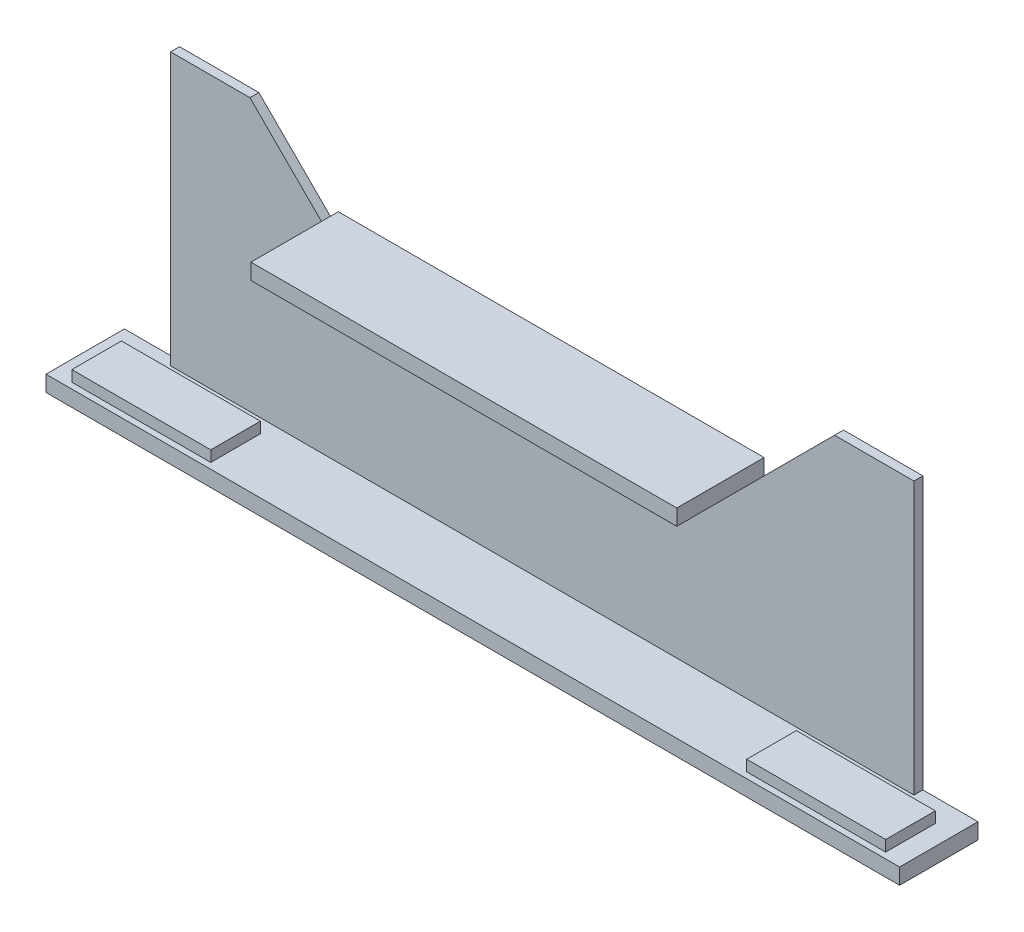
ISO-10303-21;
HEADER;
FILE_DESCRIPTION(('STEP AP214'),'2;1');
FILE_NAME('part.step','',(''),(''),'','','');
FILE_SCHEMA(('AUTOMOTIVE_DESIGN { 1 0 10303 214 1 1 1 1 }'));
ENDSEC;
DATA;
#1=APPLICATION_CONTEXT('core data for automotive mechanical design processes');
#2=APPLICATION_PROTOCOL_DEFINITION('international standard','automotive_design',2000,#1);
#3=PRODUCT_CONTEXT('',#1,'mechanical');
#4=PRODUCT('Part','Part','',(#3));
#5=PRODUCT_RELATED_PRODUCT_CATEGORY('part','',(#4));
#6=PRODUCT_DEFINITION_FORMATION('','',#4);
#7=PRODUCT_DEFINITION_CONTEXT('part definition',#1,'design');
#8=PRODUCT_DEFINITION('design','',#6,#7);
#9=PRODUCT_DEFINITION_SHAPE('','',#8);
#10=(LENGTH_UNIT() NAMED_UNIT(*) SI_UNIT(.MILLI.,.METRE.));
#11=(NAMED_UNIT(*) PLANE_ANGLE_UNIT() SI_UNIT($,.RADIAN.));
#12=(NAMED_UNIT(*) SI_UNIT($,.STERADIAN.) SOLID_ANGLE_UNIT());
#13=UNCERTAINTY_MEASURE_WITH_UNIT(LENGTH_MEASURE(1.E-05),#10,'distance_accuracy_value','');
#14=(GEOMETRIC_REPRESENTATION_CONTEXT(3) GLOBAL_UNCERTAINTY_ASSIGNED_CONTEXT((#13)) GLOBAL_UNIT_ASSIGNED_CONTEXT((#10,
#11,#12)) REPRESENTATION_CONTEXT('',''));
#15=CARTESIAN_POINT('',(0.,0.,0.));
#16=DIRECTION('',(0.,0.,1.));
#17=DIRECTION('',(1.,0.,0.));
#18=AXIS2_PLACEMENT_3D('',#15,#16,#17);
#19=CARTESIAN_POINT('',(0.,15.9999999999956,9.));
#20=DIRECTION('',(0.,0.,-1.));
#21=DIRECTION('',(-1.,0.,0.));
#22=AXIS2_PLACEMENT_3D('',#19,#20,#21);
#23=PLANE('',#22);
#24=DIRECTION('',(1.,0.,0.));
#25=VECTOR('',#24,1.);
#26=CARTESIAN_POINT('',(215.5,210.,9.));
#27=LINE('',#26,#25);
#28=CARTESIAN_POINT('',(215.5,210.,9.));
#29=VERTEX_POINT('',#28);
#30=CARTESIAN_POINT('',(644.50000000001,210.,9.));
#31=VERTEX_POINT('',#30);
#32=EDGE_CURVE('E217',#29,#31,#27,.T.);
#33=ORIENTED_EDGE('',*,*,#32,.F.);
#34=DIRECTION('',(-0.707106781186546,0.707106781186549,0.));
#35=VECTOR('',#34,1.);
#36=CARTESIAN_POINT('',(135.5,290.,9.));
#37=LINE('',#36,#35);
#38=CARTESIAN_POINT('',(135.5,290.,9.));
#39=VERTEX_POINT('',#38);
#40=EDGE_CURVE('E299',#29,#39,#37,.T.);
#41=ORIENTED_EDGE('',*,*,#40,.T.);
#42=DIRECTION('',(-1.,0.,0.));
#43=VECTOR('',#42,1.);
#44=CARTESIAN_POINT('',(55.4999999999975,289.999999999996,9.));
#45=LINE('',#44,#43);
#46=CARTESIAN_POINT('',(55.4999999999975,289.999999999996,9.));
#47=VERTEX_POINT('',#46);
#48=EDGE_CURVE('E301',#39,#47,#45,.T.);
#49=ORIENTED_EDGE('',*,*,#48,.T.);
#50=DIRECTION('',(0.,-1.,0.));
#51=VECTOR('',#50,1.);
#52=CARTESIAN_POINT('',(55.4999999999975,15.9999999999956,9.));
#53=LINE('',#52,#51);
#54=CARTESIAN_POINT('',(55.4999999999975,15.9999999999956,9.));
#55=VERTEX_POINT('',#54);
#56=EDGE_CURVE('E303',#47,#55,#53,.T.);
#57=ORIENTED_EDGE('',*,*,#56,.T.);
#58=DIRECTION('',(-1.,0.,0.));
#59=VECTOR('',#58,1.);
#60=CARTESIAN_POINT('',(0.,15.9999999999956,9.));
#61=LINE('',#60,#59);
#62=CARTESIAN_POINT('',(804.499999999995,15.9999999999956,9.));
#63=VERTEX_POINT('',#62);
#64=EDGE_CURVE('E11',#63,#55,#61,.T.);
#65=ORIENTED_EDGE('',*,*,#64,.F.);
#66=DIRECTION('',(0.,1.,0.));
#67=VECTOR('',#66,1.);
#68=CARTESIAN_POINT('',(804.499999999995,15.9999999999956,9.));
#69=LINE('',#68,#67);
#70=CARTESIAN_POINT('',(804.499999999995,289.999999999996,9.));
#71=VERTEX_POINT('',#70);
#72=EDGE_CURVE('E297',#63,#71,#69,.T.);
#73=ORIENTED_EDGE('',*,*,#72,.T.);
#74=DIRECTION('',(-1.,0.,0.));
#75=VECTOR('',#74,1.);
#76=CARTESIAN_POINT('',(804.499999999995,289.999999999996,9.));
#77=LINE('',#76,#75);
#78=CARTESIAN_POINT('',(724.5,290.,9.));
#79=VERTEX_POINT('',#78);
#80=EDGE_CURVE('E294',#71,#79,#77,.T.);
#81=ORIENTED_EDGE('',*,*,#80,.T.);
#82=DIRECTION('',(-0.707106781186501,-0.707106781186594,0.));
#83=VECTOR('',#82,1.);
#84=CARTESIAN_POINT('',(724.5,290.,9.));
#85=LINE('',#84,#83);
#86=EDGE_CURVE('E296',#79,#31,#85,.T.);
#87=ORIENTED_EDGE('',*,*,#86,.T.);
#88=EDGE_LOOP('',(#33,#41,#49,#57,#65,#73,#81,#87));
#89=FACE_BOUND('',#88,.T.);
#90=ADVANCED_FACE('F34',(#89),#23,.F.);
#91=CARTESIAN_POINT('',(0.,15.9999999999956,9.));
#92=DIRECTION('',(0.,-1.,0.));
#93=DIRECTION('',(0.,0.,-1.));
#94=AXIS2_PLACEMENT_3D('',#91,#92,#93);
#95=PLANE('',#94);
#96=DIRECTION('',(-1.02487462960706E-13,0.,1.));
#97=VECTOR('',#96,1.);
#98=CARTESIAN_POINT('',(20.0000000000051,15.9999999999956,22.9999999999981));
#99=LINE('',#98,#97);
#100=CARTESIAN_POINT('',(20.0000000000051,15.9999999999956,22.9999999999981));
#101=VERTEX_POINT('',#100);
#102=CARTESIAN_POINT('',(20.,15.9999999999956,73.));
#103=VERTEX_POINT('',#102);
#104=EDGE_CURVE('E248',#101,#103,#99,.T.);
#105=ORIENTED_EDGE('',*,*,#104,.F.);
#106=DIRECTION('',(-1.,0.,0.));
#107=VECTOR('',#106,1.);
#108=CARTESIAN_POINT('',(20.0000000000051,15.9999999999956,22.9999999999981));
#109=LINE('',#108,#107);
#110=CARTESIAN_POINT('',(160.,15.9999999999956,23.));
#111=VERTEX_POINT('',#110);
#112=EDGE_CURVE('E253',#111,#101,#109,.T.);
#113=ORIENTED_EDGE('',*,*,#112,.F.);
#114=DIRECTION('',(0.,0.,-1.));
#115=VECTOR('',#114,1.);
#116=CARTESIAN_POINT('',(160.,15.9999999999956,23.));
#117=LINE('',#116,#115);
#118=CARTESIAN_POINT('',(160.,15.9999999999956,73.));
#119=VERTEX_POINT('',#118);
#120=EDGE_CURVE('E265',#119,#111,#117,.T.);
#121=ORIENTED_EDGE('',*,*,#120,.F.);
#122=DIRECTION('',(1.,0.,0.));
#123=VECTOR('',#122,1.);
#124=CARTESIAN_POINT('',(20.,15.9999999999956,73.));
#125=LINE('',#124,#123);
#126=EDGE_CURVE('E262',#103,#119,#125,.T.);
#127=ORIENTED_EDGE('',*,*,#126,.F.);
#128=EDGE_LOOP('',(#105,#113,#121,#127));
#129=FACE_BOUND('',#128,.T.);
#130=DIRECTION('',(-1.,0.,0.));
#131=VECTOR('',#130,1.);
#132=CARTESIAN_POINT('',(0.,15.9999999999956,0.));
#133=LINE('',#132,#131);
#134=CARTESIAN_POINT('',(55.4999999999975,15.9999999999956,0.));
#135=VERTEX_POINT('',#134);
#136=CARTESIAN_POINT('',(0.,15.9999999999956,0.));
#137=VERTEX_POINT('',#136);
#138=EDGE_CURVE('E330',#135,#137,#133,.T.);
#139=ORIENTED_EDGE('',*,*,#138,.T.);
#140=DIRECTION('',(0.,0.,-1.));
#141=VECTOR('',#140,1.);
#142=CARTESIAN_POINT('',(0.,15.9999999999956,9.));
#143=LINE('',#142,#141);
#144=CARTESIAN_POINT('',(0.,15.9999999999956,79.));
#145=VERTEX_POINT('',#144);
#146=EDGE_CURVE('E332',#145,#137,#143,.T.);
#147=ORIENTED_EDGE('',*,*,#146,.F.);
#148=DIRECTION('',(-1.,0.,0.));
#149=VECTOR('',#148,1.);
#150=CARTESIAN_POINT('',(0.,15.9999999999956,79.));
#151=LINE('',#150,#149);
#152=CARTESIAN_POINT('',(859.999999999992,15.9999999999956,79.));
#153=VERTEX_POINT('',#152);
#154=EDGE_CURVE('E290',#153,#145,#151,.T.);
#155=ORIENTED_EDGE('',*,*,#154,.F.);
#156=DIRECTION('',(0.,0.,-1.));
#157=VECTOR('',#156,1.);
#158=CARTESIAN_POINT('',(859.999999999992,15.9999999999956,9.));
#159=LINE('',#158,#157);
#160=CARTESIAN_POINT('',(859.999999999992,15.9999999999956,0.));
#161=VERTEX_POINT('',#160);
#162=EDGE_CURVE('E361',#153,#161,#159,.T.);
#163=ORIENTED_EDGE('',*,*,#162,.T.);
#164=DIRECTION('',(-1.,0.,0.));
#165=VECTOR('',#164,1.);
#166=CARTESIAN_POINT('',(859.999999999992,15.9999999999956,0.));
#167=LINE('',#166,#165);
#168=CARTESIAN_POINT('',(804.499999999995,15.9999999999956,0.));
#169=VERTEX_POINT('',#168);
#170=EDGE_CURVE('E310',#161,#169,#167,.T.);
#171=ORIENTED_EDGE('',*,*,#170,.T.);
#172=DIRECTION('',(0.,0.,-1.));
#173=VECTOR('',#172,1.);
#174=CARTESIAN_POINT('',(804.499999999995,15.9999999999956,9.));
#175=LINE('',#174,#173);
#176=EDGE_CURVE('E360',#63,#169,#175,.T.);
#177=ORIENTED_EDGE('',*,*,#176,.F.);
#178=ORIENTED_EDGE('',*,*,#64,.T.);
#179=DIRECTION('',(0.,0.,-1.));
#180=VECTOR('',#179,1.);
#181=CARTESIAN_POINT('',(55.4999999999975,15.9999999999956,9.));
#182=LINE('',#181,#180);
#183=EDGE_CURVE('E335',#55,#135,#182,.T.);
#184=ORIENTED_EDGE('',*,*,#183,.T.);
#185=EDGE_LOOP('',(#139,#147,#155,#163,#171,#177,#178,#184));
#186=FACE_BOUND('',#185,.T.);
#187=DIRECTION('',(1.06581410364011E-13,0.,-1.));
#188=VECTOR('',#187,1.);
#189=CARTESIAN_POINT('',(839.999999999998,15.9999999999956,22.9999999999981));
#190=LINE('',#189,#188);
#191=CARTESIAN_POINT('',(839.999999999993,15.9999999999956,73.));
#192=VERTEX_POINT('',#191);
#193=CARTESIAN_POINT('',(839.999999999998,15.9999999999956,22.9999999999981));
#194=VERTEX_POINT('',#193);
#195=EDGE_CURVE('E237',#192,#194,#190,.T.);
#196=ORIENTED_EDGE('',*,*,#195,.F.);
#197=DIRECTION('',(1.,0.,0.));
#198=VECTOR('',#197,1.);
#199=CARTESIAN_POINT('',(839.999999999993,15.9999999999956,73.));
#200=LINE('',#199,#198);
#201=CARTESIAN_POINT('',(699.999999999993,15.9999999999956,73.));
#202=VERTEX_POINT('',#201);
#203=EDGE_CURVE('E242',#202,#192,#200,.T.);
#204=ORIENTED_EDGE('',*,*,#203,.F.);
#205=DIRECTION('',(0.,0.,1.));
#206=VECTOR('',#205,1.);
#207=CARTESIAN_POINT('',(699.999999999992,15.9999999999956,23.));
#208=LINE('',#207,#206);
#209=CARTESIAN_POINT('',(699.999999999992,15.9999999999956,23.));
#210=VERTEX_POINT('',#209);
#211=EDGE_CURVE('E56',#210,#202,#208,.T.);
#212=ORIENTED_EDGE('',*,*,#211,.F.);
#213=DIRECTION('',(-1.,0.,0.));
#214=VECTOR('',#213,1.);
#215=CARTESIAN_POINT('',(839.999999999998,15.9999999999956,22.9999999999981));
#216=LINE('',#215,#214);
#217=EDGE_CURVE('E51',#194,#210,#216,.T.);
#218=ORIENTED_EDGE('',*,*,#217,.F.);
#219=EDGE_LOOP('',(#196,#204,#212,#218));
#220=FACE_BOUND('',#219,.T.);
#221=ADVANCED_FACE('F427',(#129,#186,#220),#95,.F.);
#222=CARTESIAN_POINT('',(0.,15.9999999999956,0.));
#223=DIRECTION('',(0.,0.,-1.));
#224=DIRECTION('',(-1.,0.,0.));
#225=AXIS2_PLACEMENT_3D('',#222,#223,#224);
#226=PLANE('',#225);
#227=ORIENTED_EDGE('',*,*,#138,.F.);
#228=DIRECTION('',(0.,-1.,0.));
#229=VECTOR('',#228,1.);
#230=CARTESIAN_POINT('',(55.4999999999975,15.9999999999956,0.));
#231=LINE('',#230,#229);
#232=CARTESIAN_POINT('',(55.4999999999975,289.999999999996,0.));
#233=VERTEX_POINT('',#232);
#234=EDGE_CURVE('E328',#233,#135,#231,.T.);
#235=ORIENTED_EDGE('',*,*,#234,.F.);
#236=DIRECTION('',(-1.,0.,0.));
#237=VECTOR('',#236,1.);
#238=CARTESIAN_POINT('',(55.4999999999975,289.999999999996,0.));
#239=LINE('',#238,#237);
#240=CARTESIAN_POINT('',(135.5,290.,0.));
#241=VERTEX_POINT('',#240);
#242=EDGE_CURVE('E326',#241,#233,#239,.T.);
#243=ORIENTED_EDGE('',*,*,#242,.F.);
#244=DIRECTION('',(-0.707106781186546,0.707106781186549,0.));
#245=VECTOR('',#244,1.);
#246=CARTESIAN_POINT('',(135.5,290.,0.));
#247=LINE('',#246,#245);
#248=CARTESIAN_POINT('',(215.5,210.,0.));
#249=VERTEX_POINT('',#248);
#250=EDGE_CURVE('E324',#249,#241,#247,.T.);
#251=ORIENTED_EDGE('',*,*,#250,.F.);
#252=DIRECTION('',(0.,-1.,0.));
#253=VECTOR('',#252,1.);
#254=CARTESIAN_POINT('',(215.5,210.,0.));
#255=LINE('',#254,#253);
#256=CARTESIAN_POINT('',(215.5,226.,0.));
#257=VERTEX_POINT('',#256);
#258=EDGE_CURVE('E322',#257,#249,#255,.T.);
#259=ORIENTED_EDGE('',*,*,#258,.F.);
#260=DIRECTION('',(-1.,0.,0.));
#261=VECTOR('',#260,1.);
#262=CARTESIAN_POINT('',(215.5,226.,0.));
#263=LINE('',#262,#261);
#264=CARTESIAN_POINT('',(644.50000000001,226.,0.));
#265=VERTEX_POINT('',#264);
#266=EDGE_CURVE('E320',#265,#257,#263,.T.);
#267=ORIENTED_EDGE('',*,*,#266,.F.);
#268=DIRECTION('',(0.,1.,0.));
#269=VECTOR('',#268,1.);
#270=CARTESIAN_POINT('',(644.50000000001,210.,0.));
#271=LINE('',#270,#269);
#272=CARTESIAN_POINT('',(644.50000000001,210.,0.));
#273=VERTEX_POINT('',#272);
#274=EDGE_CURVE('E318',#273,#265,#271,.T.);
#275=ORIENTED_EDGE('',*,*,#274,.F.);
#276=DIRECTION('',(-0.707106781186501,-0.707106781186594,0.));
#277=VECTOR('',#276,1.);
#278=CARTESIAN_POINT('',(724.5,290.,0.));
#279=LINE('',#278,#277);
#280=CARTESIAN_POINT('',(724.5,290.,0.));
#281=VERTEX_POINT('',#280);
#282=EDGE_CURVE('E316',#281,#273,#279,.T.);
#283=ORIENTED_EDGE('',*,*,#282,.F.);
#284=DIRECTION('',(-1.,0.,0.));
#285=VECTOR('',#284,1.);
#286=CARTESIAN_POINT('',(804.499999999995,289.999999999996,0.));
#287=LINE('',#286,#285);
#288=CARTESIAN_POINT('',(804.499999999995,289.999999999996,0.));
#289=VERTEX_POINT('',#288);
#290=EDGE_CURVE('E314',#289,#281,#287,.T.);
#291=ORIENTED_EDGE('',*,*,#290,.F.);
#292=DIRECTION('',(0.,1.,0.));
#293=VECTOR('',#292,1.);
#294=CARTESIAN_POINT('',(804.499999999995,15.9999999999956,0.));
#295=LINE('',#294,#293);
#296=EDGE_CURVE('E312',#169,#289,#295,.T.);
#297=ORIENTED_EDGE('',*,*,#296,.F.);
#298=ORIENTED_EDGE('',*,*,#170,.F.);
#299=DIRECTION('',(-4.64905891561913E-13,1.,0.));
#300=VECTOR('',#299,1.);
#301=CARTESIAN_POINT('',(860.,0.,0.));
#302=LINE('',#301,#300);
#303=CARTESIAN_POINT('',(860.,0.,0.));
#304=VERTEX_POINT('',#303);
#305=EDGE_CURVE('E308',#304,#161,#302,.T.);
#306=ORIENTED_EDGE('',*,*,#305,.F.);
#307=DIRECTION('',(1.,0.,0.));
#308=VECTOR('',#307,1.);
#309=CARTESIAN_POINT('',(0.,0.,0.));
#310=LINE('',#309,#308);
#311=CARTESIAN_POINT('',(0.,0.,0.));
#312=VERTEX_POINT('',#311);
#313=EDGE_CURVE('E306',#312,#304,#310,.T.);
#314=ORIENTED_EDGE('',*,*,#313,.F.);
#315=DIRECTION('',(0.,-1.,0.));
#316=VECTOR('',#315,1.);
#317=CARTESIAN_POINT('',(0.,0.,0.));
#318=LINE('',#317,#316);
#319=EDGE_CURVE('E293',#137,#312,#318,.T.);
#320=ORIENTED_EDGE('',*,*,#319,.F.);
#321=EDGE_LOOP('',(#227,#235,#243,#251,#259,#267,#275,#283,#291,#297,#298,#306,#314,#320));
#322=FACE_BOUND('',#321,.T.);
#323=ADVANCED_FACE('F415',(#322),#226,.T.);
#324=CARTESIAN_POINT('',(0.,0.,9.));
#325=DIRECTION('',(1.,0.,0.));
#326=DIRECTION('',(0.,1.,0.));
#327=AXIS2_PLACEMENT_3D('',#324,#325,#326);
#328=PLANE('',#327);
#329=ORIENTED_EDGE('',*,*,#319,.T.);
#330=DIRECTION('',(0.,0.,-1.));
#331=VECTOR('',#330,1.);
#332=CARTESIAN_POINT('',(0.,0.,9.));
#333=LINE('',#332,#331);
#334=CARTESIAN_POINT('',(0.,0.,79.));
#335=VERTEX_POINT('',#334);
#336=EDGE_CURVE('E43',#335,#312,#333,.T.);
#337=ORIENTED_EDGE('',*,*,#336,.F.);
#338=DIRECTION('',(0.,-1.,0.));
#339=VECTOR('',#338,1.);
#340=CARTESIAN_POINT('',(0.,0.,79.));
#341=LINE('',#340,#339);
#342=EDGE_CURVE('E281',#145,#335,#341,.T.);
#343=ORIENTED_EDGE('',*,*,#342,.F.);
#344=ORIENTED_EDGE('',*,*,#146,.T.);
#345=EDGE_LOOP('',(#329,#337,#343,#344));
#346=FACE_BOUND('',#345,.T.);
#347=ADVANCED_FACE('F36',(#346),#328,.F.);
#348=CARTESIAN_POINT('',(0.,0.,9.));
#349=DIRECTION('',(0.,1.,0.));
#350=DIRECTION('',(0.,0.,1.));
#351=AXIS2_PLACEMENT_3D('',#348,#349,#350);
#352=PLANE('',#351);
#353=ORIENTED_EDGE('',*,*,#313,.T.);
#354=DIRECTION('',(0.,0.,-1.));
#355=VECTOR('',#354,1.);
#356=CARTESIAN_POINT('',(860.,0.,9.));
#357=LINE('',#356,#355);
#358=CARTESIAN_POINT('',(860.,0.,79.));
#359=VERTEX_POINT('',#358);
#360=EDGE_CURVE('E364',#359,#304,#357,.T.);
#361=ORIENTED_EDGE('',*,*,#360,.F.);
#362=DIRECTION('',(1.,0.,0.));
#363=VECTOR('',#362,1.);
#364=CARTESIAN_POINT('',(0.,0.,79.));
#365=LINE('',#364,#363);
#366=EDGE_CURVE('E284',#335,#359,#365,.T.);
#367=ORIENTED_EDGE('',*,*,#366,.F.);
#368=ORIENTED_EDGE('',*,*,#336,.T.);
#369=EDGE_LOOP('',(#353,#361,#367,#368));
#370=FACE_BOUND('',#369,.T.);
#371=ADVANCED_FACE('F606',(#370),#352,.F.);
#372=CARTESIAN_POINT('',(860.,0.,9.));
#373=DIRECTION('',(-1.,-4.64905891561913E-13,0.));
#374=DIRECTION('',(4.64905891561913E-13,-1.,0.));
#375=AXIS2_PLACEMENT_3D('',#372,#373,#374);
#376=PLANE('',#375);
#377=ORIENTED_EDGE('',*,*,#305,.T.);
#378=ORIENTED_EDGE('',*,*,#162,.F.);
#379=DIRECTION('',(-4.64905891561913E-13,1.,0.));
#380=VECTOR('',#379,1.);
#381=CARTESIAN_POINT('',(859.999999999992,15.9999999999956,79.));
#382=LINE('',#381,#380);
#383=EDGE_CURVE('E287',#359,#153,#382,.T.);
#384=ORIENTED_EDGE('',*,*,#383,.F.);
#385=ORIENTED_EDGE('',*,*,#360,.T.);
#386=EDGE_LOOP('',(#377,#378,#384,#385));
#387=FACE_BOUND('',#386,.T.);
#388=ADVANCED_FACE('F611',(#387),#376,.F.);
#389=CARTESIAN_POINT('',(804.499999999995,15.9999999999956,9.));
#390=DIRECTION('',(-1.,0.,0.));
#391=DIRECTION('',(0.,0.,1.));
#392=AXIS2_PLACEMENT_3D('',#389,#390,#391);
#393=PLANE('',#392);
#394=ORIENTED_EDGE('',*,*,#296,.T.);
#395=DIRECTION('',(0.,0.,-1.));
#396=VECTOR('',#395,1.);
#397=CARTESIAN_POINT('',(804.499999999995,289.999999999996,9.));
#398=LINE('',#397,#396);
#399=EDGE_CURVE('E357',#71,#289,#398,.T.);
#400=ORIENTED_EDGE('',*,*,#399,.F.);
#401=ORIENTED_EDGE('',*,*,#72,.F.);
#402=ORIENTED_EDGE('',*,*,#176,.T.);
#403=EDGE_LOOP('',(#394,#400,#401,#402));
#404=FACE_BOUND('',#403,.T.);
#405=ADVANCED_FACE('F389',(#404),#393,.F.);
#406=CARTESIAN_POINT('',(804.499999999995,289.999999999996,9.));
#407=DIRECTION('',(0.,-1.,0.));
#408=DIRECTION('',(1.,0.,0.));
#409=AXIS2_PLACEMENT_3D('',#406,#407,#408);
#410=PLANE('',#409);
#411=ORIENTED_EDGE('',*,*,#290,.T.);
#412=DIRECTION('',(0.,0.,-1.));
#413=VECTOR('',#412,1.);
#414=CARTESIAN_POINT('',(724.5,290.,9.));
#415=LINE('',#414,#413);
#416=EDGE_CURVE('E354',#79,#281,#415,.T.);
#417=ORIENTED_EDGE('',*,*,#416,.F.);
#418=ORIENTED_EDGE('',*,*,#80,.F.);
#419=ORIENTED_EDGE('',*,*,#399,.T.);
#420=EDGE_LOOP('',(#411,#417,#418,#419));
#421=FACE_BOUND('',#420,.T.);
#422=ADVANCED_FACE('F393',(#421),#410,.F.);
#423=CARTESIAN_POINT('',(724.5,290.,9.));
#424=DIRECTION('',(0.707106781186594,-0.707106781186501,0.));
#425=DIRECTION('',(0.707106781186501,0.707106781186594,0.));
#426=AXIS2_PLACEMENT_3D('',#423,#424,#425);
#427=PLANE('',#426);
#428=ORIENTED_EDGE('',*,*,#282,.T.);
#429=DIRECTION('',(0.,0.,-1.));
#430=VECTOR('',#429,1.);
#431=CARTESIAN_POINT('',(644.50000000001,210.,9.));
#432=LINE('',#431,#430);
#433=EDGE_CURVE('E351',#31,#273,#432,.T.);
#434=ORIENTED_EDGE('',*,*,#433,.F.);
#435=ORIENTED_EDGE('',*,*,#86,.F.);
#436=ORIENTED_EDGE('',*,*,#416,.T.);
#437=EDGE_LOOP('',(#428,#434,#435,#436));
#438=FACE_BOUND('',#437,.T.);
#439=ADVANCED_FACE('F398',(#438),#427,.F.);
#440=CARTESIAN_POINT('',(644.50000000001,210.,9.));
#441=DIRECTION('',(-1.,0.,0.));
#442=DIRECTION('',(0.,0.,1.));
#443=AXIS2_PLACEMENT_3D('',#440,#441,#442);
#444=PLANE('',#443);
#445=ORIENTED_EDGE('',*,*,#274,.T.);
#446=DIRECTION('',(0.,0.,-1.));
#447=VECTOR('',#446,1.);
#448=CARTESIAN_POINT('',(644.50000000001,226.,9.));
#449=LINE('',#448,#447);
#450=CARTESIAN_POINT('',(644.5,226.,88.));
#451=VERTEX_POINT('',#450);
#452=EDGE_CURVE('E348',#451,#265,#449,.T.);
#453=ORIENTED_EDGE('',*,*,#452,.F.);
#454=DIRECTION('',(0.,1.,0.));
#455=VECTOR('',#454,1.);
#456=CARTESIAN_POINT('',(644.5,226.,88.));
#457=LINE('',#456,#455);
#458=CARTESIAN_POINT('',(644.5,210.,88.));
#459=VERTEX_POINT('',#458);
#460=EDGE_CURVE('E223',#459,#451,#457,.T.);
#461=ORIENTED_EDGE('',*,*,#460,.F.);
#462=DIRECTION('',(0.,0.,-1.));
#463=VECTOR('',#462,1.);
#464=CARTESIAN_POINT('',(644.5,210.,88.));
#465=LINE('',#464,#463);
#466=EDGE_CURVE('E229',#459,#31,#465,.T.);
#467=ORIENTED_EDGE('',*,*,#466,.T.);
#468=ORIENTED_EDGE('',*,*,#433,.T.);
#469=EDGE_LOOP('',(#445,#453,#461,#467,#468));
#470=FACE_BOUND('',#469,.T.);
#471=ADVANCED_FACE('F432',(#470),#444,.F.);
#472=CARTESIAN_POINT('',(215.5,226.,9.));
#473=DIRECTION('',(0.,-1.,0.));
#474=DIRECTION('',(0.,0.,-1.));
#475=AXIS2_PLACEMENT_3D('',#472,#473,#474);
#476=PLANE('',#475);
#477=ORIENTED_EDGE('',*,*,#266,.T.);
#478=DIRECTION('',(0.,0.,-1.));
#479=VECTOR('',#478,1.);
#480=CARTESIAN_POINT('',(215.5,226.,9.));
#481=LINE('',#480,#479);
#482=CARTESIAN_POINT('',(215.5,226.,88.));
#483=VERTEX_POINT('',#482);
#484=EDGE_CURVE('E345',#483,#257,#481,.T.);
#485=ORIENTED_EDGE('',*,*,#484,.F.);
#486=DIRECTION('',(-1.,0.,0.));
#487=VECTOR('',#486,1.);
#488=CARTESIAN_POINT('',(215.5,226.,88.));
#489=LINE('',#488,#487);
#490=EDGE_CURVE('E226',#451,#483,#489,.T.);
#491=ORIENTED_EDGE('',*,*,#490,.F.);
#492=ORIENTED_EDGE('',*,*,#452,.T.);
#493=EDGE_LOOP('',(#477,#485,#491,#492));
#494=FACE_BOUND('',#493,.T.);
#495=ADVANCED_FACE('F438',(#494),#476,.F.);
#496=CARTESIAN_POINT('',(215.5,210.,9.));
#497=DIRECTION('',(1.,0.,0.));
#498=DIRECTION('',(0.,1.,0.));
#499=AXIS2_PLACEMENT_3D('',#496,#497,#498);
#500=PLANE('',#499);
#501=ORIENTED_EDGE('',*,*,#258,.T.);
#502=DIRECTION('',(0.,0.,-1.));
#503=VECTOR('',#502,1.);
#504=CARTESIAN_POINT('',(215.5,210.,9.));
#505=LINE('',#504,#503);
#506=EDGE_CURVE('E342',#29,#249,#505,.T.);
#507=ORIENTED_EDGE('',*,*,#506,.F.);
#508=DIRECTION('',(0.,0.,-1.));
#509=VECTOR('',#508,1.);
#510=CARTESIAN_POINT('',(215.5,210.,88.));
#511=LINE('',#510,#509);
#512=CARTESIAN_POINT('',(215.5,210.,88.));
#513=VERTEX_POINT('',#512);
#514=EDGE_CURVE('E234',#513,#29,#511,.T.);
#515=ORIENTED_EDGE('',*,*,#514,.F.);
#516=DIRECTION('',(0.,-1.,0.));
#517=VECTOR('',#516,1.);
#518=CARTESIAN_POINT('',(215.5,226.,88.));
#519=LINE('',#518,#517);
#520=EDGE_CURVE('E218',#483,#513,#519,.T.);
#521=ORIENTED_EDGE('',*,*,#520,.F.);
#522=ORIENTED_EDGE('',*,*,#484,.T.);
#523=EDGE_LOOP('',(#501,#507,#515,#521,#522));
#524=FACE_BOUND('',#523,.T.);
#525=ADVANCED_FACE('F407',(#524),#500,.F.);
#526=CARTESIAN_POINT('',(135.5,290.,9.));
#527=DIRECTION('',(-0.707106781186549,-0.707106781186546,0.));
#528=DIRECTION('',(0.707106781186546,-0.707106781186549,0.));
#529=AXIS2_PLACEMENT_3D('',#526,#527,#528);
#530=PLANE('',#529);
#531=ORIENTED_EDGE('',*,*,#250,.T.);
#532=DIRECTION('',(0.,0.,-1.));
#533=VECTOR('',#532,1.);
#534=CARTESIAN_POINT('',(135.5,290.,9.));
#535=LINE('',#534,#533);
#536=EDGE_CURVE('E339',#39,#241,#535,.T.);
#537=ORIENTED_EDGE('',*,*,#536,.F.);
#538=ORIENTED_EDGE('',*,*,#40,.F.);
#539=ORIENTED_EDGE('',*,*,#506,.T.);
#540=EDGE_LOOP('',(#531,#537,#538,#539));
#541=FACE_BOUND('',#540,.T.);
#542=ADVANCED_FACE('F411',(#541),#530,.F.);
#543=CARTESIAN_POINT('',(55.4999999999975,289.999999999996,9.));
#544=DIRECTION('',(0.,-1.,0.));
#545=DIRECTION('',(1.,0.,0.));
#546=AXIS2_PLACEMENT_3D('',#543,#544,#545);
#547=PLANE('',#546);
#548=ORIENTED_EDGE('',*,*,#242,.T.);
#549=DIRECTION('',(0.,0.,-1.));
#550=VECTOR('',#549,1.);
#551=CARTESIAN_POINT('',(55.4999999999975,289.999999999996,9.));
#552=LINE('',#551,#550);
#553=EDGE_CURVE('E336',#47,#233,#552,.T.);
#554=ORIENTED_EDGE('',*,*,#553,.F.);
#555=ORIENTED_EDGE('',*,*,#48,.F.);
#556=ORIENTED_EDGE('',*,*,#536,.T.);
#557=EDGE_LOOP('',(#548,#554,#555,#556));
#558=FACE_BOUND('',#557,.T.);
#559=ADVANCED_FACE('F420',(#558),#547,.F.);
#560=CARTESIAN_POINT('',(55.4999999999975,15.9999999999956,9.));
#561=DIRECTION('',(1.,0.,0.));
#562=DIRECTION('',(0.,0.,-1.));
#563=AXIS2_PLACEMENT_3D('',#560,#561,#562);
#564=PLANE('',#563);
#565=ORIENTED_EDGE('',*,*,#234,.T.);
#566=ORIENTED_EDGE('',*,*,#183,.F.);
#567=ORIENTED_EDGE('',*,*,#56,.F.);
#568=ORIENTED_EDGE('',*,*,#553,.T.);
#569=EDGE_LOOP('',(#565,#566,#567,#568));
#570=FACE_BOUND('',#569,.T.);
#571=ADVANCED_FACE('F424',(#570),#564,.F.);
#572=CARTESIAN_POINT('',(0.,15.9999999999956,79.));
#573=DIRECTION('',(0.,0.,-1.));
#574=DIRECTION('',(-1.,0.,0.));
#575=AXIS2_PLACEMENT_3D('',#572,#573,#574);
#576=PLANE('',#575);
#577=ORIENTED_EDGE('',*,*,#342,.T.);
#578=ORIENTED_EDGE('',*,*,#366,.T.);
#579=ORIENTED_EDGE('',*,*,#383,.T.);
#580=ORIENTED_EDGE('',*,*,#154,.T.);
#581=EDGE_LOOP('',(#577,#578,#579,#580));
#582=FACE_BOUND('',#581,.T.);
#583=ADVANCED_FACE('F456',(#582),#576,.F.);
#584=CARTESIAN_POINT('',(20.0000000000051,26.9999999999956,22.9999999999981));
#585=DIRECTION('',(1.,0.,1.02487462960706E-13));
#586=DIRECTION('',(1.02487462960706E-13,0.,-1.));
#587=AXIS2_PLACEMENT_3D('',#584,#585,#586);
#588=PLANE('',#587);
#589=ORIENTED_EDGE('',*,*,#104,.T.);
#590=DIRECTION('',(0.,-1.,0.));
#591=VECTOR('',#590,1.);
#592=CARTESIAN_POINT('',(20.,26.9999999999956,73.));
#593=LINE('',#592,#591);
#594=CARTESIAN_POINT('',(20.,26.9999999999956,73.));
#595=VERTEX_POINT('',#594);
#596=EDGE_CURVE('E278',#595,#103,#593,.T.);
#597=ORIENTED_EDGE('',*,*,#596,.F.);
#598=DIRECTION('',(-1.02487462960706E-13,0.,1.));
#599=VECTOR('',#598,1.);
#600=CARTESIAN_POINT('',(20.0000000000051,26.9999999999956,22.9999999999981));
#601=LINE('',#600,#599);
#602=CARTESIAN_POINT('',(20.0000000000051,26.9999999999956,22.9999999999981));
#603=VERTEX_POINT('',#602);
#604=EDGE_CURVE('E249',#603,#595,#601,.T.);
#605=ORIENTED_EDGE('',*,*,#604,.F.);
#606=DIRECTION('',(0.,-1.,0.));
#607=VECTOR('',#606,1.);
#608=CARTESIAN_POINT('',(20.0000000000051,26.9999999999956,22.9999999999981));
#609=LINE('',#608,#607);
#610=EDGE_CURVE('E259',#603,#101,#609,.T.);
#611=ORIENTED_EDGE('',*,*,#610,.T.);
#612=EDGE_LOOP('',(#589,#597,#605,#611));
#613=FACE_BOUND('',#612,.T.);
#614=ADVANCED_FACE('F486',(#613),#588,.F.);
#615=CARTESIAN_POINT('',(20.,26.9999999999956,73.));
#616=DIRECTION('',(0.,0.,-1.));
#617=DIRECTION('',(-1.,0.,0.));
#618=AXIS2_PLACEMENT_3D('',#615,#616,#617);
#619=PLANE('',#618);
#620=ORIENTED_EDGE('',*,*,#126,.T.);
#621=DIRECTION('',(0.,-1.,0.));
#622=VECTOR('',#621,1.);
#623=CARTESIAN_POINT('',(160.,26.9999999999956,73.));
#624=LINE('',#623,#622);
#625=CARTESIAN_POINT('',(160.,26.9999999999956,73.));
#626=VERTEX_POINT('',#625);
#627=EDGE_CURVE('E275',#626,#119,#624,.T.);
#628=ORIENTED_EDGE('',*,*,#627,.F.);
#629=DIRECTION('',(1.,0.,0.));
#630=VECTOR('',#629,1.);
#631=CARTESIAN_POINT('',(20.,26.9999999999956,73.));
#632=LINE('',#631,#630);
#633=EDGE_CURVE('E252',#595,#626,#632,.T.);
#634=ORIENTED_EDGE('',*,*,#633,.F.);
#635=ORIENTED_EDGE('',*,*,#596,.T.);
#636=EDGE_LOOP('',(#620,#628,#634,#635));
#637=FACE_BOUND('',#636,.T.);
#638=ADVANCED_FACE('F493',(#637),#619,.F.);
#639=CARTESIAN_POINT('',(160.,26.9999999999956,23.));
#640=DIRECTION('',(-1.,0.,0.));
#641=DIRECTION('',(0.,0.,1.));
#642=AXIS2_PLACEMENT_3D('',#639,#640,#641);
#643=PLANE('',#642);
#644=ORIENTED_EDGE('',*,*,#120,.T.);
#645=DIRECTION('',(0.,-1.,0.));
#646=VECTOR('',#645,1.);
#647=CARTESIAN_POINT('',(160.,26.9999999999956,23.));
#648=LINE('',#647,#646);
#649=CARTESIAN_POINT('',(160.,26.9999999999956,23.));
#650=VERTEX_POINT('',#649);
#651=EDGE_CURVE('E272',#650,#111,#648,.T.);
#652=ORIENTED_EDGE('',*,*,#651,.F.);
#653=DIRECTION('',(0.,0.,-1.));
#654=VECTOR('',#653,1.);
#655=CARTESIAN_POINT('',(160.,26.9999999999956,23.));
#656=LINE('',#655,#654);
#657=EDGE_CURVE('E255',#626,#650,#656,.T.);
#658=ORIENTED_EDGE('',*,*,#657,.F.);
#659=ORIENTED_EDGE('',*,*,#627,.T.);
#660=EDGE_LOOP('',(#644,#652,#658,#659));
#661=FACE_BOUND('',#660,.T.);
#662=ADVANCED_FACE('F500',(#661),#643,.F.);
#663=CARTESIAN_POINT('',(20.0000000000051,26.9999999999956,22.9999999999981));
#664=DIRECTION('',(0.,0.,1.));
#665=DIRECTION('',(1.,0.,0.));
#666=AXIS2_PLACEMENT_3D('',#663,#664,#665);
#667=PLANE('',#666);
#668=ORIENTED_EDGE('',*,*,#112,.T.);
#669=ORIENTED_EDGE('',*,*,#610,.F.);
#670=DIRECTION('',(-1.,0.,0.));
#671=VECTOR('',#670,1.);
#672=CARTESIAN_POINT('',(20.0000000000051,26.9999999999956,22.9999999999981));
#673=LINE('',#672,#671);
#674=EDGE_CURVE('E257',#650,#603,#673,.T.);
#675=ORIENTED_EDGE('',*,*,#674,.F.);
#676=ORIENTED_EDGE('',*,*,#651,.T.);
#677=EDGE_LOOP('',(#668,#669,#675,#676));
#678=FACE_BOUND('',#677,.T.);
#679=ADVANCED_FACE('F508',(#678),#667,.F.);
#680=CARTESIAN_POINT('',(20.,26.9999999999956,73.));
#681=DIRECTION('',(0.,1.,0.));
#682=DIRECTION('',(0.,0.,1.));
#683=AXIS2_PLACEMENT_3D('',#680,#681,#682);
#684=PLANE('',#683);
#685=ORIENTED_EDGE('',*,*,#604,.T.);
#686=ORIENTED_EDGE('',*,*,#633,.T.);
#687=ORIENTED_EDGE('',*,*,#657,.T.);
#688=ORIENTED_EDGE('',*,*,#674,.T.);
#689=EDGE_LOOP('',(#685,#686,#687,#688));
#690=FACE_BOUND('',#689,.T.);
#691=ADVANCED_FACE('F516',(#690),#684,.T.);
#692=CARTESIAN_POINT('',(839.999999999998,21.9999999999956,22.9999999999981));
#693=DIRECTION('',(-1.,0.,-1.06581410364011E-13));
#694=DIRECTION('',(-1.06581410364011E-13,0.,1.));
#695=AXIS2_PLACEMENT_3D('',#692,#693,#694);
#696=PLANE('',#695);
#697=ORIENTED_EDGE('',*,*,#195,.T.);
#698=DIRECTION('',(0.,-1.,0.));
#699=VECTOR('',#698,1.);
#700=CARTESIAN_POINT('',(839.999999999998,21.9999999999956,22.9999999999981));
#701=LINE('',#700,#699);
#702=CARTESIAN_POINT('',(839.999999999993,26.9999999999956,23.));
#703=VERTEX_POINT('',#702);
#704=EDGE_CURVE('E246',#703,#194,#701,.T.);
#705=ORIENTED_EDGE('',*,*,#704,.F.);
#706=DIRECTION('',(0.,0.,-1.));
#707=VECTOR('',#706,1.);
#708=CARTESIAN_POINT('',(839.999999999993,26.9999999999956,23.));
#709=LINE('',#708,#707);
#710=CARTESIAN_POINT('',(839.999999999993,26.9999999999956,73.));
#711=VERTEX_POINT('',#710);
#712=EDGE_CURVE('E208',#711,#703,#709,.T.);
#713=ORIENTED_EDGE('',*,*,#712,.F.);
#714=DIRECTION('',(0.,-1.,0.));
#715=VECTOR('',#714,1.);
#716=CARTESIAN_POINT('',(839.999999999993,21.9999999999956,73.));
#717=LINE('',#716,#715);
#718=EDGE_CURVE('E199',#711,#192,#717,.T.);
#719=ORIENTED_EDGE('',*,*,#718,.T.);
#720=EDGE_LOOP('',(#697,#705,#713,#719));
#721=FACE_BOUND('',#720,.T.);
#722=ADVANCED_FACE('F525',(#721),#696,.F.);
#723=CARTESIAN_POINT('',(839.999999999998,21.9999999999956,22.9999999999981));
#724=DIRECTION('',(0.,0.,1.));
#725=DIRECTION('',(1.,0.,0.));
#726=AXIS2_PLACEMENT_3D('',#723,#724,#725);
#727=PLANE('',#726);
#728=ORIENTED_EDGE('',*,*,#217,.T.);
#729=DIRECTION('',(0.,-1.,0.));
#730=VECTOR('',#729,1.);
#731=CARTESIAN_POINT('',(699.999999999992,21.9999999999956,23.));
#732=LINE('',#731,#730);
#733=CARTESIAN_POINT('',(699.999999999992,26.9999999999956,23.));
#734=VERTEX_POINT('',#733);
#735=EDGE_CURVE('E198',#734,#210,#732,.T.);
#736=ORIENTED_EDGE('',*,*,#735,.F.);
#737=DIRECTION('',(-1.,0.,0.));
#738=VECTOR('',#737,1.);
#739=CARTESIAN_POINT('',(699.999999999992,26.9999999999956,23.));
#740=LINE('',#739,#738);
#741=EDGE_CURVE('E212',#703,#734,#740,.T.);
#742=ORIENTED_EDGE('',*,*,#741,.F.);
#743=ORIENTED_EDGE('',*,*,#704,.T.);
#744=EDGE_LOOP('',(#728,#736,#742,#743));
#745=FACE_BOUND('',#744,.T.);
#746=ADVANCED_FACE('F534',(#745),#727,.F.);
#747=CARTESIAN_POINT('',(699.999999999992,21.9999999999956,23.));
#748=DIRECTION('',(1.,0.,0.));
#749=DIRECTION('',(0.,0.,-1.));
#750=AXIS2_PLACEMENT_3D('',#747,#748,#749);
#751=PLANE('',#750);
#752=ORIENTED_EDGE('',*,*,#211,.T.);
#753=DIRECTION('',(0.,-1.,0.));
#754=VECTOR('',#753,1.);
#755=CARTESIAN_POINT('',(699.999999999993,21.9999999999956,73.));
#756=LINE('',#755,#754);
#757=CARTESIAN_POINT('',(699.999999999992,26.9999999999956,73.));
#758=VERTEX_POINT('',#757);
#759=EDGE_CURVE('E189',#758,#202,#756,.T.);
#760=ORIENTED_EDGE('',*,*,#759,.F.);
#761=DIRECTION('',(0.,0.,1.));
#762=VECTOR('',#761,1.);
#763=CARTESIAN_POINT('',(699.999999999992,26.9999999999956,23.));
#764=LINE('',#763,#762);
#765=EDGE_CURVE('E194',#734,#758,#764,.T.);
#766=ORIENTED_EDGE('',*,*,#765,.F.);
#767=ORIENTED_EDGE('',*,*,#735,.T.);
#768=EDGE_LOOP('',(#752,#760,#766,#767));
#769=FACE_BOUND('',#768,.T.);
#770=ADVANCED_FACE('F191',(#769),#751,.F.);
#771=CARTESIAN_POINT('',(839.999999999993,21.9999999999956,73.));
#772=DIRECTION('',(0.,0.,-1.));
#773=DIRECTION('',(-1.,0.,0.));
#774=AXIS2_PLACEMENT_3D('',#771,#772,#773);
#775=PLANE('',#774);
#776=ORIENTED_EDGE('',*,*,#203,.T.);
#777=ORIENTED_EDGE('',*,*,#718,.F.);
#778=DIRECTION('',(1.,0.,0.));
#779=VECTOR('',#778,1.);
#780=CARTESIAN_POINT('',(699.999999999992,26.9999999999956,73.));
#781=LINE('',#780,#779);
#782=EDGE_CURVE('E202',#758,#711,#781,.T.);
#783=ORIENTED_EDGE('',*,*,#782,.F.);
#784=ORIENTED_EDGE('',*,*,#759,.T.);
#785=EDGE_LOOP('',(#776,#777,#783,#784));
#786=FACE_BOUND('',#785,.T.);
#787=ADVANCED_FACE('F203',(#786),#775,.F.);
#788=CARTESIAN_POINT('',(215.5,210.,88.));
#789=DIRECTION('',(0.,1.,0.));
#790=DIRECTION('',(0.,0.,1.));
#791=AXIS2_PLACEMENT_3D('',#788,#789,#790);
#792=PLANE('',#791);
#793=ORIENTED_EDGE('',*,*,#32,.T.);
#794=ORIENTED_EDGE('',*,*,#466,.F.);
#795=DIRECTION('',(1.,0.,0.));
#796=VECTOR('',#795,1.);
#797=CARTESIAN_POINT('',(215.5,210.,88.));
#798=LINE('',#797,#796);
#799=EDGE_CURVE('E221',#513,#459,#798,.T.);
#800=ORIENTED_EDGE('',*,*,#799,.F.);
#801=ORIENTED_EDGE('',*,*,#514,.T.);
#802=EDGE_LOOP('',(#793,#794,#800,#801));
#803=FACE_BOUND('',#802,.T.);
#804=ADVANCED_FACE('F403',(#803),#792,.F.);
#805=CARTESIAN_POINT('',(215.5,210.,88.));
#806=DIRECTION('',(0.,0.,1.));
#807=DIRECTION('',(1.,0.,0.));
#808=AXIS2_PLACEMENT_3D('',#805,#806,#807);
#809=PLANE('',#808);
#810=ORIENTED_EDGE('',*,*,#520,.T.);
#811=ORIENTED_EDGE('',*,*,#799,.T.);
#812=ORIENTED_EDGE('',*,*,#460,.T.);
#813=ORIENTED_EDGE('',*,*,#490,.T.);
#814=EDGE_LOOP('',(#810,#811,#812,#813));
#815=FACE_BOUND('',#814,.T.);
#816=ADVANCED_FACE('F436',(#815),#809,.T.);
#817=CARTESIAN_POINT('',(0.,26.9999999999956,0.));
#818=DIRECTION('',(0.,1.,0.));
#819=DIRECTION('',(0.,0.,1.));
#820=AXIS2_PLACEMENT_3D('',#817,#818,#819);
#821=PLANE('',#820);
#822=ORIENTED_EDGE('',*,*,#765,.T.);
#823=ORIENTED_EDGE('',*,*,#782,.T.);
#824=ORIENTED_EDGE('',*,*,#712,.T.);
#825=ORIENTED_EDGE('',*,*,#741,.T.);
#826=EDGE_LOOP('',(#822,#823,#824,#825));
#827=FACE_BOUND('',#826,.T.);
#828=ADVANCED_FACE('F210',(#827),#821,.T.);
#829=CLOSED_SHELL('',(#90,#221,#323,#347,#371,#388,#405,#422,#439,#471,#495,#525,#542,#559,#571,
#583,#614,#638,#662,#679,#691,#722,#746,#770,#787,#804,#816,#828));
#830=MANIFOLD_SOLID_BREP('B2',#829);
#831=ADVANCED_BREP_SHAPE_REPRESENTATION('',(#18,#830),#14);
#832=SHAPE_DEFINITION_REPRESENTATION(#9,#831);
ENDSEC;
END-ISO-10303-21;
